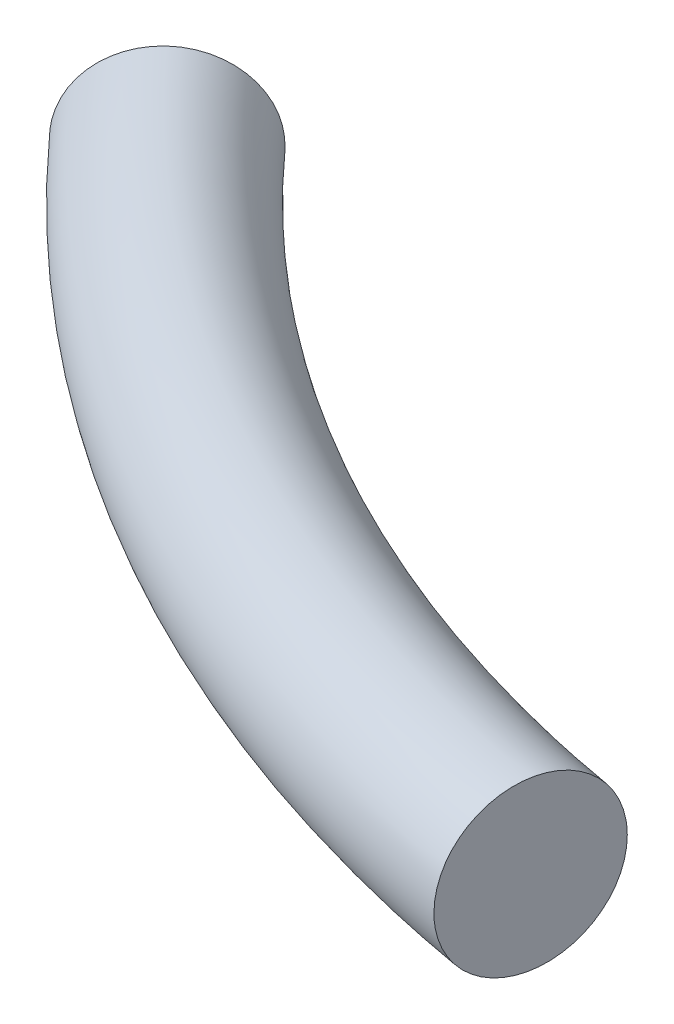
ISO-10303-21;
HEADER;
FILE_DESCRIPTION(('STEP AP214'),'2;1');
FILE_NAME('part.step','',(''),(''),'','','');
FILE_SCHEMA(('AUTOMOTIVE_DESIGN { 1 0 10303 214 1 1 1 1 }'));
ENDSEC;
DATA;
#1=APPLICATION_CONTEXT('core data for automotive mechanical design processes');
#2=APPLICATION_PROTOCOL_DEFINITION('international standard','automotive_design',2000,#1);
#3=PRODUCT_CONTEXT('',#1,'mechanical');
#4=PRODUCT('Part','Part','',(#3));
#5=PRODUCT_RELATED_PRODUCT_CATEGORY('part','',(#4));
#6=PRODUCT_DEFINITION_FORMATION('','',#4);
#7=PRODUCT_DEFINITION_CONTEXT('part definition',#1,'design');
#8=PRODUCT_DEFINITION('design','',#6,#7);
#9=PRODUCT_DEFINITION_SHAPE('','',#8);
#10=(LENGTH_UNIT() NAMED_UNIT(*) SI_UNIT(.MILLI.,.METRE.));
#11=(NAMED_UNIT(*) PLANE_ANGLE_UNIT() SI_UNIT($,.RADIAN.));
#12=(NAMED_UNIT(*) SI_UNIT($,.STERADIAN.) SOLID_ANGLE_UNIT());
#13=UNCERTAINTY_MEASURE_WITH_UNIT(LENGTH_MEASURE(1.E-05),#10,'distance_accuracy_value','');
#14=(GEOMETRIC_REPRESENTATION_CONTEXT(3) GLOBAL_UNCERTAINTY_ASSIGNED_CONTEXT((#13)) GLOBAL_UNIT_ASSIGNED_CONTEXT((#10,
#11,#12)) REPRESENTATION_CONTEXT('',''));
#15=CARTESIAN_POINT('',(0.,0.,0.));
#16=DIRECTION('',(0.,0.,1.));
#17=DIRECTION('',(1.,0.,0.));
#18=AXIS2_PLACEMENT_3D('',#15,#16,#17);
#19=CARTESIAN_POINT('',(0.,0.,0.));
#20=DIRECTION('',(0.669130606358878,0.,0.743144825477376));
#21=DIRECTION('',(0.743144825477376,0.,-0.669130606358878));
#22=AXIS2_PLACEMENT_3D('',#19,#20,#21);
#23=PLANE('',#22);
#24=CARTESIAN_POINT('',(-5.39684838268771,5.2698,4.85934411023453));
#25=CARTESIAN_POINT('',(-5.39684701108143,5.24734475844036,4.85934287523469));
#26=CARTESIAN_POINT('',(-5.39543800703027,5.22486914274062,4.8580742022886));
#27=CARTESIAN_POINT('',(-5.38983253157893,5.1805175487025,4.853027009522));
#28=CARTESIAN_POINT('',(-5.38563009437031,5.158642958289,4.84924311806344));
#29=CARTESIAN_POINT('',(-5.37456295185965,5.11619038165277,4.83927821818803));
#30=CARTESIAN_POINT('',(-5.36770299823837,5.09561015699665,4.83310148820373));
#31=CARTESIAN_POINT('',(-5.35150282943512,5.05626266277757,4.81851479069498));
#32=CARTESIAN_POINT('',(-5.34215909572463,5.03749801701042,4.81010165507321));
#33=CARTESIAN_POINT('',(-5.32127649766309,5.00237251506183,4.79129887932315));
#34=CARTESIAN_POINT('',(-5.3097407471602,4.98600830669737,4.78091204291634));
#35=CARTESIAN_POINT('',(-5.28477493327069,4.9560951150933,4.75843272312104));
#36=CARTESIAN_POINT('',(-5.27134224063951,4.94255010496093,4.7463378723501));
#37=CARTESIAN_POINT('',(-5.24298708773165,4.91869805812555,4.72080677799519));
#38=CARTESIAN_POINT('',(-5.2280657196674,4.9083886701999,4.70737151784368));
#39=CARTESIAN_POINT('',(-5.19714763034138,4.89128651697562,4.67953274517257));
#40=CARTESIAN_POINT('',(-5.18115084587832,4.88449395856254,4.66512917574627));
#41=CARTESIAN_POINT('',(-5.14853734059005,4.87461938707083,4.63576384368598));
#42=CARTESIAN_POINT('',(-5.13192063801012,4.87153726487626,4.62080209748012));
#43=CARTESIAN_POINT('',(-5.09853854646018,4.8691706838228,4.59074472724143));
#44=CARTESIAN_POINT('',(-5.08177315749016,4.86988622496392,4.57564910320861));
#45=CARTESIAN_POINT('',(-5.04856911790698,4.87509474506563,4.54575205168088));
#46=CARTESIAN_POINT('',(-5.03213047691749,4.87958783511791,4.53095063285118));
#47=CARTESIAN_POINT('',(-5.00004808454575,4.89222364907398,4.50206351700891));
#48=CARTESIAN_POINT('',(-4.98440428646723,4.90036615830119,4.48797777795082));
#49=CARTESIAN_POINT('',(-4.95434356067461,4.92007688548478,4.46091097887262));
#50=CARTESIAN_POINT('',(-4.93992753552568,4.93164759608104,4.44793073152583));
#51=CARTESIAN_POINT('',(-4.9127640866323,4.95786514969766,4.42347265228515));
#52=CARTESIAN_POINT('',(-4.90001435844817,4.97250766984349,4.41199274546446));
#53=CARTESIAN_POINT('',(-4.87650450530106,5.00448602525169,4.39082437860994));
#54=CARTESIAN_POINT('',(-4.86574721518505,5.02182563442235,4.38113847108381));
#55=CARTESIAN_POINT('',(-4.84656418539091,5.05866468164223,4.36386599347528));
#56=CARTESIAN_POINT('',(-4.8381351515479,5.07816101291839,4.3562764573135));
#57=CARTESIAN_POINT('',(-4.82381426426736,5.11881373737466,4.34338187248817));
#58=CARTESIAN_POINT('',(-4.81792696141227,5.1399730284603,4.33808092118745));
#59=CARTESIAN_POINT('',(-4.80888921657172,5.18328650996402,4.32994329918169));
#60=CARTESIAN_POINT('',(-4.80573295018342,5.20543847660513,4.32710138416078));
#61=CARTESIAN_POINT('',(-4.8028810035725,5.24173023785299,4.32453347989818));
#62=CARTESIAN_POINT('',(-4.80233166478699,5.25576113714254,4.32403885303401));
#63=CARTESIAN_POINT('',(-4.80233389391209,5.29225524155964,4.32404086014727));
#64=CARTESIAN_POINT('',(-4.80374289796326,5.31473085725938,4.32530953309338));
#65=CARTESIAN_POINT('',(-4.80934837341459,5.35908245129751,4.33035672585997));
#66=CARTESIAN_POINT('',(-4.81355081062322,5.380957041711,4.33414061731854));
#67=CARTESIAN_POINT('',(-4.82461795313387,5.42340961834723,4.34410551719395));
#68=CARTESIAN_POINT('',(-4.83147790675515,5.44398984300335,4.35028224717824));
#69=CARTESIAN_POINT('',(-4.84767807555841,5.48333733722242,4.36486894468699));
#70=CARTESIAN_POINT('',(-4.8570218092689,5.50210198298958,4.37328208030876));
#71=CARTESIAN_POINT('',(-4.87790440733044,5.53722748493817,4.39208485605882));
#72=CARTESIAN_POINT('',(-4.88944015783333,5.55359169330263,4.40247169246564));
#73=CARTESIAN_POINT('',(-4.91440597172283,5.5835048849067,4.42495101226093));
#74=CARTESIAN_POINT('',(-4.92783866435402,5.59704989503907,4.43704586303187));
#75=CARTESIAN_POINT('',(-4.95619381726187,5.62090194187445,4.46257695738678));
#76=CARTESIAN_POINT('',(-4.97111518532613,5.6312113298001,4.47601221753829));
#77=CARTESIAN_POINT('',(-5.00203327465214,5.64831348302438,4.5038509902094));
#78=CARTESIAN_POINT('',(-5.01803005911521,5.65510604143746,4.5182545596357));
#79=CARTESIAN_POINT('',(-5.05064356440347,5.66498061292917,4.54761989169599));
#80=CARTESIAN_POINT('',(-5.0672602669834,5.66806273512374,4.56258163790186));
#81=CARTESIAN_POINT('',(-5.10064235853334,5.6704293161772,4.59263900814055));
#82=CARTESIAN_POINT('',(-5.11740774750336,5.66971377503608,4.60773463217337));
#83=CARTESIAN_POINT('',(-5.15061178708655,5.66450525493437,4.6376316837011));
#84=CARTESIAN_POINT('',(-5.16705042807603,5.66001216488209,4.6524331025308));
#85=CARTESIAN_POINT('',(-5.19913282044777,5.64737635092602,4.68132021837307));
#86=CARTESIAN_POINT('',(-5.2147766185263,5.63923384169881,4.69540595743115));
#87=CARTESIAN_POINT('',(-5.24483734431892,5.61952311451522,4.72247275650934));
#88=CARTESIAN_POINT('',(-5.25925336946785,5.60795240391896,4.73545300385615));
#89=CARTESIAN_POINT('',(-5.28641681836122,5.58173485030234,4.75991108309682));
#90=CARTESIAN_POINT('',(-5.29916654654536,5.56709233015651,4.77139098991751));
#91=CARTESIAN_POINT('',(-5.32267639969247,5.53511397474831,4.79255935677202));
#92=CARTESIAN_POINT('',(-5.33343368980847,5.51777436557765,4.80224526429816));
#93=CARTESIAN_POINT('',(-5.35261671960261,5.48093531835777,4.81951774190669));
#94=CARTESIAN_POINT('',(-5.36104575344563,5.46143898708161,4.82710727806847));
#95=CARTESIAN_POINT('',(-5.37536664072617,5.42078626262534,4.84000186289379));
#96=CARTESIAN_POINT('',(-5.38125394358125,5.3996269715397,4.84530281419453));
#97=CARTESIAN_POINT('',(-5.3902916884218,5.35631349003598,4.85344043620029));
#98=CARTESIAN_POINT('',(-5.3934479548101,5.33416152339487,4.85628235122119));
#99=CARTESIAN_POINT('',(-5.39629990142103,5.297869762147,4.85885025548379));
#100=CARTESIAN_POINT('',(-5.39684924020654,5.28383886285746,4.85934488234796));
#101=CARTESIAN_POINT('',(-5.39684838268771,5.2698,4.85934411023453));
#102=B_SPLINE_CURVE_WITH_KNOTS('',3,(#24,#25,#26,#27,#28,#29,#30,#31,#32,#33,#34,#35,#36,#37,
#38,#39,#40,#41,#42,#43,#44,#45,#46,#47,#48,#49,#50,#51,#52,#53,#54,#55,#56,#57,#58,#59,#60,#61,
#62,#63,#64,#65,#66,#67,#68,#69,#70,#71,#72,#73,#74,#75,#76,#77,#78,#79,#80,#81,#82,#83,#84,#85,
#86,#87,#88,#89,#90,#91,#92,#93,#94,#95,#96,#97,#98,#99,#100,#101),.UNSPECIFIED.,.T.,.F.,(4,2,2,
2,2,2,2,2,2,2,2,2,2,2,2,2,2,2,2,2,2,2,2,2,2,2,2,2,2,2,2,2,2,2,2,2,2,2,4),(0.,0.067321719094076,
0.134787678055462,0.2021335594909,0.269575356418626,0.336922056232694,0.40436303479347,
0.471754892083668,0.539150713403566,0.606544552708822,0.673938392014078,0.741334213333976,
0.808726070624175,0.876167049184948,0.943513748999018,1.01095554592846,1.07830142736561,
1.14576738632871,1.21308910542449,1.25517818200736,1.32249990110144,1.38996586006282,
1.45731174149826,1.52475353842599,1.59210023824006,1.65954121680083,1.72693307409103,
1.79432889541093,1.86172273471618,1.92911657402144,1.99651239534134,2.06390425263154,
2.13134523119231,2.19869193100638,2.26613372793582,2.33347960937297,2.40094556833608,
2.46826728743186,2.51035636401472),.UNSPECIFIED.);
#103=CARTESIAN_POINT('',(-5.39684838268771,5.2698,4.85934411023453));
#104=VERTEX_POINT('',#103);
#105=EDGE_CURVE('E19',#104,#104,#102,.T.);
#106=ORIENTED_EDGE('',*,*,#105,.F.);
#107=EDGE_LOOP('',(#106));
#108=FACE_BOUND('',#107,.T.);
#109=ADVANCED_FACE('F15',(#108),#23,.F.);
#110=CARTESIAN_POINT('',(0.,0.,0.));
#111=DIRECTION('',(0.984807753012213,0.,0.173648177666902));
#112=DIRECTION('',(0.173648177666902,0.,-0.984807753012213));
#113=AXIS2_PLACEMENT_3D('',#110,#111,#112);
#114=PLANE('',#113);
#115=CARTESIAN_POINT('',(-1.12214505498739,5.2698,6.36400084932495));
#116=CARTESIAN_POINT('',(-1.12214537548606,5.24734475844036,6.36400266696325));
#117=CARTESIAN_POINT('',(-1.12247461277255,5.22486914274062,6.36586986440046));
#118=CARTESIAN_POINT('',(-1.12378442556235,5.1805175487025,6.37329818186234));
#119=CARTESIAN_POINT('',(-1.12476639507626,5.158642958289,6.37886720771399));
#120=CARTESIAN_POINT('',(-1.12735241742758,5.11619038165277,6.39353326926018));
#121=CARTESIAN_POINT('',(-1.12895535995557,5.09561015699665,6.40262400807708));
#122=CARTESIAN_POINT('',(-1.13274079947441,5.05626266277757,6.42409230239951));
#123=CARTESIAN_POINT('',(-1.1349241186281,5.03749801701042,6.43647452062227));
#124=CARTESIAN_POINT('',(-1.13980368580534,5.00237251506183,6.46414792124218));
#125=CARTESIAN_POINT('',(-1.14249920622636,4.98600830669737,6.47943497720029));
#126=CARTESIAN_POINT('',(-1.14833288485434,4.9560951150933,6.51251941274467));
#127=CARTESIAN_POINT('',(-1.15147165742814,4.94255010496093,6.53032027657835));
#128=CARTESIAN_POINT('',(-1.15809731162246,4.91869805812555,6.5678962287537));
#129=CARTESIAN_POINT('',(-1.16158393802935,4.90838867019989,6.58766986970691));
#130=CARTESIAN_POINT('',(-1.16880846504528,4.89128651697562,6.62864219842766));
#131=CARTESIAN_POINT('',(-1.17254638042235,4.88449395856254,6.64984096994891));
#132=CARTESIAN_POINT('',(-1.18016706964265,4.87461938707083,6.69306004617696));
#133=CARTESIAN_POINT('',(-1.18404983922257,4.87153726487626,6.71508032670532));
#134=CARTESIAN_POINT('',(-1.19185012143624,4.8691706838228,6.75931792541164));
#135=CARTESIAN_POINT('',(-1.19576763407,4.86988622496392,6.7815352435896));
#136=CARTESIAN_POINT('',(-1.20352631147329,4.87509474506563,6.82553688969114));
#137=CARTESIAN_POINT('',(-1.20736747399408,4.87958783511791,6.84732120486152));
#138=CARTESIAN_POINT('',(-1.21486405982709,4.89222364907398,6.88983645580547));
#139=CARTESIAN_POINT('',(-1.21851949405067,4.90036615830119,6.91056745346046));
#140=CARTESIAN_POINT('',(-1.22554368378364,4.92007688548478,6.95040361299064));
#141=CARTESIAN_POINT('',(-1.22891222839364,4.93164759608104,6.96950757879591));
#142=CARTESIAN_POINT('',(-1.23525942107772,4.95786514969766,7.00550429727076));
#143=CARTESIAN_POINT('',(-1.23823860762256,4.97250766984349,7.02240010375971));
#144=CARTESIAN_POINT('',(-1.24373207675031,5.00448602525169,7.0535551153506));
#145=CARTESIAN_POINT('',(-1.24624569692398,5.02182563442235,7.06781056374296));
#146=CARTESIAN_POINT('',(-1.25072813164153,5.05866468164223,7.09323171426419));
#147=CARTESIAN_POINT('',(-1.25269771592194,5.07816101291839,7.10440178178592));
#148=CARTESIAN_POINT('',(-1.25604402998292,5.11881373737466,7.12337967188268));
#149=CARTESIAN_POINT('',(-1.25741969644403,5.1399730284603,7.13118146407345));
#150=CARTESIAN_POINT('',(-1.25953151619703,5.18328650996402,7.14315818904493));
#151=CARTESIAN_POINT('',(-1.26026903045774,5.20543847660513,7.14734084026338));
#152=CARTESIAN_POINT('',(-1.26093543532905,5.241730237853,7.15112021009458));
#153=CARTESIAN_POINT('',(-1.26106379749448,5.25576113714254,7.1518481881097));
#154=CARTESIAN_POINT('',(-1.26106327662224,5.29225524155964,7.15184523409641));
#155=CARTESIAN_POINT('',(-1.26073403933574,5.31473085725938,7.1499780366592));
#156=CARTESIAN_POINT('',(-1.25942422654595,5.35908245129751,7.14254971919732));
#157=CARTESIAN_POINT('',(-1.25844225703204,5.380957041711,7.13698069334567));
#158=CARTESIAN_POINT('',(-1.25585623468072,5.42340961834723,7.12231463179948));
#159=CARTESIAN_POINT('',(-1.25425329215272,5.44398984300335,7.11322389298258));
#160=CARTESIAN_POINT('',(-1.25046785263389,5.48333733722242,7.09175559866015));
#161=CARTESIAN_POINT('',(-1.2482845334802,5.50210198298958,7.07937338043739));
#162=CARTESIAN_POINT('',(-1.24340496630296,5.53722748493817,7.05169997981749));
#163=CARTESIAN_POINT('',(-1.24070944588194,5.55359169330263,7.03641292385937));
#164=CARTESIAN_POINT('',(-1.23487576725395,5.5835048849067,7.00332848831499));
#165=CARTESIAN_POINT('',(-1.23173699468016,5.59704989503907,6.98552762448131));
#166=CARTESIAN_POINT('',(-1.22511134048584,5.62090194187445,6.94795167230596));
#167=CARTESIAN_POINT('',(-1.22162471407894,5.6312113298001,6.92817803135275));
#168=CARTESIAN_POINT('',(-1.21440018706302,5.64831348302438,6.887205702632));
#169=CARTESIAN_POINT('',(-1.21066227168595,5.65510604143746,6.86600693111075));
#170=CARTESIAN_POINT('',(-1.20304158246565,5.66498061292917,6.8227878548827));
#171=CARTESIAN_POINT('',(-1.19915881288573,5.66806273512374,6.80076757435434));
#172=CARTESIAN_POINT('',(-1.19135853067205,5.6704293161772,6.75652997564802));
#173=CARTESIAN_POINT('',(-1.1874410180383,5.66971377503608,6.73431265747006));
#174=CARTESIAN_POINT('',(-1.17968234063501,5.66450525493437,6.69031101136852));
#175=CARTESIAN_POINT('',(-1.17584117811422,5.66001216488209,6.66852669619815));
#176=CARTESIAN_POINT('',(-1.16834459228121,5.64737635092602,6.62601144525419));
#177=CARTESIAN_POINT('',(-1.16468915805763,5.63923384169881,6.6052804475992));
#178=CARTESIAN_POINT('',(-1.15766496832466,5.61952311451522,6.56544428806903));
#179=CARTESIAN_POINT('',(-1.15429642371465,5.60795240391896,6.54634032226375));
#180=CARTESIAN_POINT('',(-1.14794923103057,5.58173485030234,6.5103436037889));
#181=CARTESIAN_POINT('',(-1.14497004448574,5.56709233015651,6.49344779729995));
#182=CARTESIAN_POINT('',(-1.13947657535799,5.53511397474831,6.46229278570906));
#183=CARTESIAN_POINT('',(-1.13696295518431,5.51777436557765,6.4480373373167));
#184=CARTESIAN_POINT('',(-1.13248052046677,5.48093531835777,6.42261618679547));
#185=CARTESIAN_POINT('',(-1.13051093618636,5.46143898708161,6.41144611927374));
#186=CARTESIAN_POINT('',(-1.12716462212538,5.42078626262534,6.39246822917698));
#187=CARTESIAN_POINT('',(-1.12578895566426,5.3996269715397,6.38466643698621));
#188=CARTESIAN_POINT('',(-1.12367713591127,5.35631349003598,6.37268971201474));
#189=CARTESIAN_POINT('',(-1.12293962165056,5.33416152339487,6.36850706079628));
#190=CARTESIAN_POINT('',(-1.12227321677925,5.297869762147,6.36472769096509));
#191=CARTESIAN_POINT('',(-1.12214485461382,5.28383886285746,6.36399971294996));
#192=CARTESIAN_POINT('',(-1.12214505498739,5.2698,6.36400084932495));
#193=B_SPLINE_CURVE_WITH_KNOTS('',3,(#115,#116,#117,#118,#119,#120,#121,#122,#123,#124,#125,
#126,#127,#128,#129,#130,#131,#132,#133,#134,#135,#136,#137,#138,#139,#140,#141,#142,#143,#144,
#145,#146,#147,#148,#149,#150,#151,#152,#153,#154,#155,#156,#157,#158,#159,#160,#161,#162,#163,
#164,#165,#166,#167,#168,#169,#170,#171,#172,#173,#174,#175,#176,#177,#178,#179,#180,#181,#182,
#183,#184,#185,#186,#187,#188,#189,#190,#191,#192),.UNSPECIFIED.,.T.,.F.,(4,2,2,2,2,2,2,2,2,2,2,
2,2,2,2,2,2,2,2,2,2,2,2,2,2,2,2,2,2,2,2,2,2,2,2,2,2,2,4),(0.,0.067321719094076,
0.134787678055462,0.2021335594909,0.269575356418626,0.336922056232694,0.404363034793471,
0.471754892083668,0.539150713403566,0.606544552708822,0.673938392014078,0.741334213333977,
0.808726070624175,0.876167049184949,0.943513748999018,1.01095554592846,1.07830142736561,
1.14576738632871,1.2130891054245,1.25517818200736,1.32249990110144,1.38996586006282,
1.45731174149826,1.52475353842599,1.59210023824006,1.65954121680083,1.72693307409103,
1.79432889541093,1.86172273471618,1.92911657402144,1.99651239534134,2.06390425263153,
2.13134523119231,2.19869193100638,2.26613372793582,2.33347960937297,2.40094556833607,
2.46826728743186,2.51035636401472),.UNSPECIFIED.);
#194=CARTESIAN_POINT('',(-1.12214505498739,5.2698,6.36400084932495));
#195=VERTEX_POINT('',#194);
#196=EDGE_CURVE('E10',#195,#195,#193,.T.);
#197=ORIENTED_EDGE('',*,*,#196,.F.);
#198=EDGE_LOOP('',(#197));
#199=FACE_BOUND('',#198,.T.);
#200=ADVANCED_FACE('F35',(#199),#114,.T.);
#201=CARTESIAN_POINT('',(0.,5.2698,0.));
#202=DIRECTION('',(0.,1.,0.));
#203=DIRECTION('',(0.984807753012213,0.,0.173648177666902));
#204=AXIS2_PLACEMENT_3D('',#201,#202,#203);
#205=TOROIDAL_SURFACE('',#204,6.862175820468,0.4);
#206=ORIENTED_EDGE('',*,*,#196,.T.);
#207=EDGE_LOOP('',(#206));
#208=FACE_BOUND('',#207,.T.);
#209=ORIENTED_EDGE('',*,*,#105,.T.);
#210=EDGE_LOOP('',(#209));
#211=FACE_BOUND('',#210,.T.);
#212=ADVANCED_FACE('F33',(#208,#211),#205,.T.);
#213=CLOSED_SHELL('',(#109,#200,#212));
#214=MANIFOLD_SOLID_BREP('B1',#213);
#215=ADVANCED_BREP_SHAPE_REPRESENTATION('',(#18,#214),#14);
#216=SHAPE_DEFINITION_REPRESENTATION(#9,#215);
ENDSEC;
END-ISO-10303-21;
